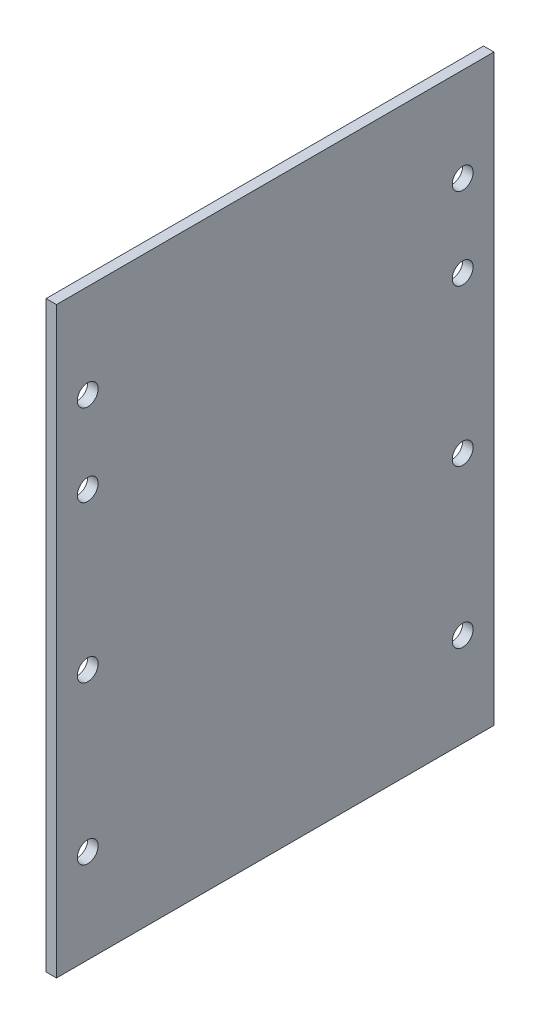
ISO-10303-21;
HEADER;
FILE_DESCRIPTION(('STEP AP214'),'2;1');
FILE_NAME('part.step','',(''),(''),'','','');
FILE_SCHEMA(('AUTOMOTIVE_DESIGN { 1 0 10303 214 1 1 1 1 }'));
ENDSEC;
DATA;
#1=APPLICATION_CONTEXT('core data for automotive mechanical design processes');
#2=APPLICATION_PROTOCOL_DEFINITION('international standard','automotive_design',2000,#1);
#3=PRODUCT_CONTEXT('',#1,'mechanical');
#4=PRODUCT('Part','Part','',(#3));
#5=PRODUCT_RELATED_PRODUCT_CATEGORY('part','',(#4));
#6=PRODUCT_DEFINITION_FORMATION('','',#4);
#7=PRODUCT_DEFINITION_CONTEXT('part definition',#1,'design');
#8=PRODUCT_DEFINITION('design','',#6,#7);
#9=PRODUCT_DEFINITION_SHAPE('','',#8);
#10=(LENGTH_UNIT() NAMED_UNIT(*) SI_UNIT(.MILLI.,.METRE.));
#11=(NAMED_UNIT(*) PLANE_ANGLE_UNIT() SI_UNIT($,.RADIAN.));
#12=(NAMED_UNIT(*) SI_UNIT($,.STERADIAN.) SOLID_ANGLE_UNIT());
#13=UNCERTAINTY_MEASURE_WITH_UNIT(LENGTH_MEASURE(1.E-05),#10,'distance_accuracy_value','');
#14=(GEOMETRIC_REPRESENTATION_CONTEXT(3) GLOBAL_UNCERTAINTY_ASSIGNED_CONTEXT((#13)) GLOBAL_UNIT_ASSIGNED_CONTEXT((#10,
#11,#12)) REPRESENTATION_CONTEXT('',''));
#15=CARTESIAN_POINT('',(0.,0.,0.));
#16=DIRECTION('',(0.,0.,1.));
#17=DIRECTION('',(1.,0.,0.));
#18=AXIS2_PLACEMENT_3D('',#15,#16,#17);
#19=CARTESIAN_POINT('',(-3.175,-88.9,66.675));
#20=DIRECTION('',(0.,0.,-1.));
#21=DIRECTION('',(-1.,0.,0.));
#22=AXIS2_PLACEMENT_3D('',#19,#20,#21);
#23=PLANE('',#22);
#24=DIRECTION('',(0.,1.,0.));
#25=VECTOR('',#24,1.);
#26=CARTESIAN_POINT('',(0.,-88.9,66.675));
#27=LINE('',#26,#25);
#28=CARTESIAN_POINT('',(0.,-88.9,66.675));
#29=VERTEX_POINT('',#28);
#30=CARTESIAN_POINT('',(0.,88.9,66.675));
#31=VERTEX_POINT('',#30);
#32=EDGE_CURVE('E113',#29,#31,#27,.T.);
#33=ORIENTED_EDGE('',*,*,#32,.T.);
#34=DIRECTION('',(1.,0.,0.));
#35=VECTOR('',#34,1.);
#36=CARTESIAN_POINT('',(-3.175,88.9,66.675));
#37=LINE('',#36,#35);
#38=CARTESIAN_POINT('',(-3.175,88.9,66.675));
#39=VERTEX_POINT('',#38);
#40=EDGE_CURVE('E11',#39,#31,#37,.T.);
#41=ORIENTED_EDGE('',*,*,#40,.F.);
#42=DIRECTION('',(0.,1.,0.));
#43=VECTOR('',#42,1.);
#44=CARTESIAN_POINT('',(-3.175,-88.9,66.675));
#45=LINE('',#44,#43);
#46=CARTESIAN_POINT('',(-3.175,-88.9,66.675));
#47=VERTEX_POINT('',#46);
#48=EDGE_CURVE('E95',#47,#39,#45,.T.);
#49=ORIENTED_EDGE('',*,*,#48,.F.);
#50=DIRECTION('',(1.,0.,0.));
#51=VECTOR('',#50,1.);
#52=CARTESIAN_POINT('',(-3.175,-88.9,66.675));
#53=LINE('',#52,#51);
#54=EDGE_CURVE('E62',#47,#29,#53,.T.);
#55=ORIENTED_EDGE('',*,*,#54,.T.);
#56=EDGE_LOOP('',(#33,#41,#49,#55));
#57=FACE_BOUND('',#56,.T.);
#58=ADVANCED_FACE('F45',(#57),#23,.F.);
#59=CARTESIAN_POINT('',(-3.175,88.9,66.675));
#60=DIRECTION('',(0.,-1.,0.));
#61=DIRECTION('',(0.,0.,-1.));
#62=AXIS2_PLACEMENT_3D('',#59,#60,#61);
#63=PLANE('',#62);
#64=DIRECTION('',(0.,0.,-1.));
#65=VECTOR('',#64,1.);
#66=CARTESIAN_POINT('',(0.,88.9,66.675));
#67=LINE('',#66,#65);
#68=CARTESIAN_POINT('',(0.,88.9,-66.675));
#69=VERTEX_POINT('',#68);
#70=EDGE_CURVE('E101',#31,#69,#67,.T.);
#71=ORIENTED_EDGE('',*,*,#70,.T.);
#72=DIRECTION('',(1.,0.,0.));
#73=VECTOR('',#72,1.);
#74=CARTESIAN_POINT('',(-3.175,88.9,-66.675));
#75=LINE('',#74,#73);
#76=CARTESIAN_POINT('',(-3.175,88.9,-66.675));
#77=VERTEX_POINT('',#76);
#78=EDGE_CURVE('E54',#77,#69,#75,.T.);
#79=ORIENTED_EDGE('',*,*,#78,.F.);
#80=DIRECTION('',(0.,0.,-1.));
#81=VECTOR('',#80,1.);
#82=CARTESIAN_POINT('',(-3.175,88.9,66.675));
#83=LINE('',#82,#81);
#84=EDGE_CURVE('E87',#39,#77,#83,.T.);
#85=ORIENTED_EDGE('',*,*,#84,.F.);
#86=ORIENTED_EDGE('',*,*,#40,.T.);
#87=EDGE_LOOP('',(#71,#79,#85,#86));
#88=FACE_BOUND('',#87,.T.);
#89=ADVANCED_FACE('F100',(#88),#63,.F.);
#90=CARTESIAN_POINT('',(-3.175,-88.9,-66.675));
#91=DIRECTION('',(0.,0.,-1.));
#92=DIRECTION('',(-1.,0.,0.));
#93=AXIS2_PLACEMENT_3D('',#90,#91,#92);
#94=PLANE('',#93);
#95=DIRECTION('',(0.,1.,0.));
#96=VECTOR('',#95,1.);
#97=CARTESIAN_POINT('',(0.,-88.9,-66.675));
#98=LINE('',#97,#96);
#99=CARTESIAN_POINT('',(0.,-88.9,-66.675));
#100=VERTEX_POINT('',#99);
#101=EDGE_CURVE('E119',#100,#69,#98,.T.);
#102=ORIENTED_EDGE('',*,*,#101,.F.);
#103=DIRECTION('',(1.,0.,0.));
#104=VECTOR('',#103,1.);
#105=CARTESIAN_POINT('',(-3.175,-88.9,-66.675));
#106=LINE('',#105,#104);
#107=CARTESIAN_POINT('',(-3.175,-88.9,-66.675));
#108=VERTEX_POINT('',#107);
#109=EDGE_CURVE('E76',#108,#100,#106,.T.);
#110=ORIENTED_EDGE('',*,*,#109,.F.);
#111=DIRECTION('',(0.,1.,0.));
#112=VECTOR('',#111,1.);
#113=CARTESIAN_POINT('',(-3.175,-88.9,-66.675));
#114=LINE('',#113,#112);
#115=EDGE_CURVE('E94',#108,#77,#114,.T.);
#116=ORIENTED_EDGE('',*,*,#115,.T.);
#117=ORIENTED_EDGE('',*,*,#78,.T.);
#118=EDGE_LOOP('',(#102,#110,#116,#117));
#119=FACE_BOUND('',#118,.T.);
#120=ADVANCED_FACE('F105',(#119),#94,.T.);
#121=CARTESIAN_POINT('',(-3.175,-88.9,66.675));
#122=DIRECTION('',(0.,-1.,0.));
#123=DIRECTION('',(0.,0.,-1.));
#124=AXIS2_PLACEMENT_3D('',#121,#122,#123);
#125=PLANE('',#124);
#126=DIRECTION('',(0.,0.,-1.));
#127=VECTOR('',#126,1.);
#128=CARTESIAN_POINT('',(0.,-88.9,66.675));
#129=LINE('',#128,#127);
#130=EDGE_CURVE('E122',#29,#100,#129,.T.);
#131=ORIENTED_EDGE('',*,*,#130,.F.);
#132=ORIENTED_EDGE('',*,*,#54,.F.);
#133=DIRECTION('',(0.,0.,-1.));
#134=VECTOR('',#133,1.);
#135=CARTESIAN_POINT('',(-3.175,-88.9,66.675));
#136=LINE('',#135,#134);
#137=EDGE_CURVE('E107',#47,#108,#136,.T.);
#138=ORIENTED_EDGE('',*,*,#137,.T.);
#139=ORIENTED_EDGE('',*,*,#109,.T.);
#140=EDGE_LOOP('',(#131,#132,#138,#139));
#141=FACE_BOUND('',#140,.T.);
#142=ADVANCED_FACE('F209',(#141),#125,.T.);
#143=CARTESIAN_POINT('',(-3.175,0.,0.));
#144=DIRECTION('',(-1.,0.,0.));
#145=DIRECTION('',(0.,0.,1.));
#146=AXIS2_PLACEMENT_3D('',#143,#144,#145);
#147=PLANE('',#146);
#148=CARTESIAN_POINT('',(-3.175,35.349999912,57.15));
#149=DIRECTION('',(1.,0.,0.));
#150=DIRECTION('',(0.,0.,-1.));
#151=AXIS2_PLACEMENT_3D('',#148,#149,#150);
#152=CIRCLE('',#151,3.17500000000001);
#153=CARTESIAN_POINT('',(-3.175,35.349999912,53.975));
#154=VERTEX_POINT('',#153);
#155=EDGE_CURVE('E156',#154,#154,#152,.T.);
#156=ORIENTED_EDGE('',*,*,#155,.T.);
#157=EDGE_LOOP('',(#156));
#158=FACE_BOUND('',#157,.T.);
#159=CARTESIAN_POINT('',(-3.175,-60.325,-57.15));
#160=DIRECTION('',(1.,0.,0.));
#161=DIRECTION('',(0.,0.,1.));
#162=AXIS2_PLACEMENT_3D('',#159,#160,#161);
#163=CIRCLE('',#162,3.175);
#164=CARTESIAN_POINT('',(-3.175,-60.325,-53.975));
#165=VERTEX_POINT('',#164);
#166=EDGE_CURVE('E165',#165,#165,#163,.T.);
#167=ORIENTED_EDGE('',*,*,#166,.T.);
#168=EDGE_LOOP('',(#167));
#169=FACE_BOUND('',#168,.T.);
#170=CARTESIAN_POINT('',(-3.175,-12.275000088,-57.15));
#171=DIRECTION('',(1.,0.,0.));
#172=DIRECTION('',(0.,0.,1.));
#173=AXIS2_PLACEMENT_3D('',#170,#171,#172);
#174=CIRCLE('',#173,3.175);
#175=CARTESIAN_POINT('',(-3.175,-12.275000088,-53.975));
#176=VERTEX_POINT('',#175);
#177=EDGE_CURVE('E140',#176,#176,#174,.T.);
#178=ORIENTED_EDGE('',*,*,#177,.T.);
#179=EDGE_LOOP('',(#178));
#180=FACE_BOUND('',#179,.T.);
#181=CARTESIAN_POINT('',(-3.175,60.325,57.15));
#182=DIRECTION('',(1.,0.,0.));
#183=DIRECTION('',(0.,0.,-1.));
#184=AXIS2_PLACEMENT_3D('',#181,#182,#183);
#185=CIRCLE('',#184,3.175);
#186=CARTESIAN_POINT('',(-3.175,60.325,53.975));
#187=VERTEX_POINT('',#186);
#188=EDGE_CURVE('E149',#187,#187,#185,.T.);
#189=ORIENTED_EDGE('',*,*,#188,.T.);
#190=EDGE_LOOP('',(#189));
#191=FACE_BOUND('',#190,.T.);
#192=CARTESIAN_POINT('',(-3.175,35.349999912,-57.15));
#193=DIRECTION('',(1.,0.,0.));
#194=DIRECTION('',(0.,0.,1.));
#195=AXIS2_PLACEMENT_3D('',#192,#193,#194);
#196=CIRCLE('',#195,3.17500000000001);
#197=CARTESIAN_POINT('',(-3.175,35.349999912,-53.975));
#198=VERTEX_POINT('',#197);
#199=EDGE_CURVE('E188',#198,#198,#196,.T.);
#200=ORIENTED_EDGE('',*,*,#199,.T.);
#201=EDGE_LOOP('',(#200));
#202=FACE_BOUND('',#201,.T.);
#203=CARTESIAN_POINT('',(-3.175,60.325,-57.15));
#204=DIRECTION('',(1.,0.,0.));
#205=DIRECTION('',(0.,0.,1.));
#206=AXIS2_PLACEMENT_3D('',#203,#204,#205);
#207=CIRCLE('',#206,3.175);
#208=CARTESIAN_POINT('',(-3.175,60.325,-53.975));
#209=VERTEX_POINT('',#208);
#210=EDGE_CURVE('E180',#209,#209,#207,.T.);
#211=ORIENTED_EDGE('',*,*,#210,.T.);
#212=EDGE_LOOP('',(#211));
#213=FACE_BOUND('',#212,.T.);
#214=CARTESIAN_POINT('',(-3.175,-12.275000088,57.15));
#215=DIRECTION('',(1.,0.,0.));
#216=DIRECTION('',(0.,0.,-1.));
#217=AXIS2_PLACEMENT_3D('',#214,#215,#216);
#218=CIRCLE('',#217,3.175);
#219=CARTESIAN_POINT('',(-3.175,-12.275000088,53.975));
#220=VERTEX_POINT('',#219);
#221=EDGE_CURVE('E172',#220,#220,#218,.T.);
#222=ORIENTED_EDGE('',*,*,#221,.T.);
#223=EDGE_LOOP('',(#222));
#224=FACE_BOUND('',#223,.T.);
#225=CARTESIAN_POINT('',(-3.175,-60.325,57.15));
#226=DIRECTION('',(1.,0.,0.));
#227=DIRECTION('',(0.,0.,-1.));
#228=AXIS2_PLACEMENT_3D('',#225,#226,#227);
#229=CIRCLE('',#228,3.175);
#230=CARTESIAN_POINT('',(-3.175,-60.325,53.975));
#231=VERTEX_POINT('',#230);
#232=EDGE_CURVE('E116',#231,#231,#229,.T.);
#233=ORIENTED_EDGE('',*,*,#232,.T.);
#234=EDGE_LOOP('',(#233));
#235=FACE_BOUND('',#234,.T.);
#236=ORIENTED_EDGE('',*,*,#48,.T.);
#237=ORIENTED_EDGE('',*,*,#84,.T.);
#238=ORIENTED_EDGE('',*,*,#115,.F.);
#239=ORIENTED_EDGE('',*,*,#137,.F.);
#240=EDGE_LOOP('',(#236,#237,#238,#239));
#241=FACE_BOUND('',#240,.T.);
#242=ADVANCED_FACE('F91',(#158,#169,#180,#191,#202,#213,#224,#235,#241),#147,.T.);
#243=CARTESIAN_POINT('',(0.,0.,0.));
#244=DIRECTION('',(-1.,0.,0.));
#245=DIRECTION('',(0.,0.,1.));
#246=AXIS2_PLACEMENT_3D('',#243,#244,#245);
#247=PLANE('',#246);
#248=CARTESIAN_POINT('',(0.,35.349999912,57.15));
#249=DIRECTION('',(1.,0.,0.));
#250=DIRECTION('',(0.,0.,-1.));
#251=AXIS2_PLACEMENT_3D('',#248,#249,#250);
#252=CIRCLE('',#251,3.17500000000001);
#253=CARTESIAN_POINT('',(0.,35.349999912,53.975));
#254=VERTEX_POINT('',#253);
#255=EDGE_CURVE('E160',#254,#254,#252,.T.);
#256=ORIENTED_EDGE('',*,*,#255,.F.);
#257=EDGE_LOOP('',(#256));
#258=FACE_BOUND('',#257,.T.);
#259=CARTESIAN_POINT('',(0.,-60.325,-57.15));
#260=DIRECTION('',(1.,0.,0.));
#261=DIRECTION('',(0.,0.,1.));
#262=AXIS2_PLACEMENT_3D('',#259,#260,#261);
#263=CIRCLE('',#262,3.175);
#264=CARTESIAN_POINT('',(0.,-60.325,-53.975));
#265=VERTEX_POINT('',#264);
#266=EDGE_CURVE('E145',#265,#265,#263,.T.);
#267=ORIENTED_EDGE('',*,*,#266,.F.);
#268=EDGE_LOOP('',(#267));
#269=FACE_BOUND('',#268,.T.);
#270=CARTESIAN_POINT('',(0.,-12.275000088,-57.15));
#271=DIRECTION('',(1.,0.,0.));
#272=DIRECTION('',(0.,0.,1.));
#273=AXIS2_PLACEMENT_3D('',#270,#271,#272);
#274=CIRCLE('',#273,3.175);
#275=CARTESIAN_POINT('',(0.,-12.275000088,-53.975));
#276=VERTEX_POINT('',#275);
#277=EDGE_CURVE('E144',#276,#276,#274,.T.);
#278=ORIENTED_EDGE('',*,*,#277,.F.);
#279=EDGE_LOOP('',(#278));
#280=FACE_BOUND('',#279,.T.);
#281=CARTESIAN_POINT('',(0.,60.325,57.15));
#282=DIRECTION('',(1.,0.,0.));
#283=DIRECTION('',(0.,0.,-1.));
#284=AXIS2_PLACEMENT_3D('',#281,#282,#283);
#285=CIRCLE('',#284,3.175);
#286=CARTESIAN_POINT('',(0.,60.325,53.975));
#287=VERTEX_POINT('',#286);
#288=EDGE_CURVE('E136',#287,#287,#285,.T.);
#289=ORIENTED_EDGE('',*,*,#288,.F.);
#290=EDGE_LOOP('',(#289));
#291=FACE_BOUND('',#290,.T.);
#292=CARTESIAN_POINT('',(0.,35.349999912,-57.15));
#293=DIRECTION('',(1.,0.,0.));
#294=DIRECTION('',(0.,0.,1.));
#295=AXIS2_PLACEMENT_3D('',#292,#293,#294);
#296=CIRCLE('',#295,3.17500000000001);
#297=CARTESIAN_POINT('',(0.,35.349999912,-53.975));
#298=VERTEX_POINT('',#297);
#299=EDGE_CURVE('E161',#298,#298,#296,.T.);
#300=ORIENTED_EDGE('',*,*,#299,.F.);
#301=EDGE_LOOP('',(#300));
#302=FACE_BOUND('',#301,.T.);
#303=CARTESIAN_POINT('',(0.,60.325,-57.15));
#304=DIRECTION('',(1.,0.,0.));
#305=DIRECTION('',(0.,0.,1.));
#306=AXIS2_PLACEMENT_3D('',#303,#304,#305);
#307=CIRCLE('',#306,3.175);
#308=CARTESIAN_POINT('',(0.,60.325,-53.975));
#309=VERTEX_POINT('',#308);
#310=EDGE_CURVE('E184',#309,#309,#307,.T.);
#311=ORIENTED_EDGE('',*,*,#310,.F.);
#312=EDGE_LOOP('',(#311));
#313=FACE_BOUND('',#312,.T.);
#314=CARTESIAN_POINT('',(0.,-12.275000088,57.15));
#315=DIRECTION('',(1.,0.,0.));
#316=DIRECTION('',(0.,0.,-1.));
#317=AXIS2_PLACEMENT_3D('',#314,#315,#316);
#318=CIRCLE('',#317,3.175);
#319=CARTESIAN_POINT('',(0.,-12.275000088,53.975));
#320=VERTEX_POINT('',#319);
#321=EDGE_CURVE('E176',#320,#320,#318,.T.);
#322=ORIENTED_EDGE('',*,*,#321,.F.);
#323=EDGE_LOOP('',(#322));
#324=FACE_BOUND('',#323,.T.);
#325=CARTESIAN_POINT('',(0.,-60.325,57.15));
#326=DIRECTION('',(1.,0.,0.));
#327=DIRECTION('',(0.,0.,-1.));
#328=AXIS2_PLACEMENT_3D('',#325,#326,#327);
#329=CIRCLE('',#328,3.175);
#330=CARTESIAN_POINT('',(0.,-60.325,53.975));
#331=VERTEX_POINT('',#330);
#332=EDGE_CURVE('E132',#331,#331,#329,.T.);
#333=ORIENTED_EDGE('',*,*,#332,.F.);
#334=EDGE_LOOP('',(#333));
#335=FACE_BOUND('',#334,.T.);
#336=ORIENTED_EDGE('',*,*,#32,.F.);
#337=ORIENTED_EDGE('',*,*,#130,.T.);
#338=ORIENTED_EDGE('',*,*,#101,.T.);
#339=ORIENTED_EDGE('',*,*,#70,.F.);
#340=EDGE_LOOP('',(#336,#337,#338,#339));
#341=FACE_BOUND('',#340,.T.);
#342=ADVANCED_FACE('F198',(#258,#269,#280,#291,#302,#313,#324,#335,#341),#247,.F.);
#343=CARTESIAN_POINT('',(-3.175,-60.325,57.15));
#344=DIRECTION('',(1.,0.,0.));
#345=DIRECTION('',(0.,0.,-1.));
#346=AXIS2_PLACEMENT_3D('',#343,#344,#345);
#347=CYLINDRICAL_SURFACE('',#346,3.175);
#348=ORIENTED_EDGE('',*,*,#232,.F.);
#349=EDGE_LOOP('',(#348));
#350=FACE_BOUND('',#349,.T.);
#351=ORIENTED_EDGE('',*,*,#332,.T.);
#352=EDGE_LOOP('',(#351));
#353=FACE_BOUND('',#352,.T.);
#354=ADVANCED_FACE('F201',(#350,#353),#347,.F.);
#355=CARTESIAN_POINT('',(-3.175,-12.275000088,57.15));
#356=DIRECTION('',(1.,0.,0.));
#357=DIRECTION('',(0.,0.,-1.));
#358=AXIS2_PLACEMENT_3D('',#355,#356,#357);
#359=CYLINDRICAL_SURFACE('',#358,3.175);
#360=ORIENTED_EDGE('',*,*,#221,.F.);
#361=EDGE_LOOP('',(#360));
#362=FACE_BOUND('',#361,.T.);
#363=ORIENTED_EDGE('',*,*,#321,.T.);
#364=EDGE_LOOP('',(#363));
#365=FACE_BOUND('',#364,.T.);
#366=ADVANCED_FACE('F256',(#362,#365),#359,.F.);
#367=CARTESIAN_POINT('',(-3.175,60.325,-57.15));
#368=DIRECTION('',(1.,0.,0.));
#369=DIRECTION('',(0.,0.,-1.));
#370=AXIS2_PLACEMENT_3D('',#367,#368,#369);
#371=CYLINDRICAL_SURFACE('',#370,3.175);
#372=ORIENTED_EDGE('',*,*,#210,.F.);
#373=EDGE_LOOP('',(#372));
#374=FACE_BOUND('',#373,.T.);
#375=ORIENTED_EDGE('',*,*,#310,.T.);
#376=EDGE_LOOP('',(#375));
#377=FACE_BOUND('',#376,.T.);
#378=ADVANCED_FACE('F266',(#374,#377),#371,.F.);
#379=CARTESIAN_POINT('',(-3.175,35.349999912,-57.15));
#380=DIRECTION('',(1.,0.,0.));
#381=DIRECTION('',(0.,0.,-1.));
#382=AXIS2_PLACEMENT_3D('',#379,#380,#381);
#383=CYLINDRICAL_SURFACE('',#382,3.17500000000001);
#384=ORIENTED_EDGE('',*,*,#199,.F.);
#385=EDGE_LOOP('',(#384));
#386=FACE_BOUND('',#385,.T.);
#387=ORIENTED_EDGE('',*,*,#299,.T.);
#388=EDGE_LOOP('',(#387));
#389=FACE_BOUND('',#388,.T.);
#390=ADVANCED_FACE('F196',(#386,#389),#383,.F.);
#391=CARTESIAN_POINT('',(-3.175,60.325,57.15));
#392=DIRECTION('',(1.,0.,0.));
#393=DIRECTION('',(0.,0.,-1.));
#394=AXIS2_PLACEMENT_3D('',#391,#392,#393);
#395=CYLINDRICAL_SURFACE('',#394,3.175);
#396=ORIENTED_EDGE('',*,*,#188,.F.);
#397=EDGE_LOOP('',(#396));
#398=FACE_BOUND('',#397,.T.);
#399=ORIENTED_EDGE('',*,*,#288,.T.);
#400=EDGE_LOOP('',(#399));
#401=FACE_BOUND('',#400,.T.);
#402=ADVANCED_FACE('F285',(#398,#401),#395,.F.);
#403=CARTESIAN_POINT('',(-3.175,-12.275000088,-57.15));
#404=DIRECTION('',(1.,0.,0.));
#405=DIRECTION('',(0.,0.,-1.));
#406=AXIS2_PLACEMENT_3D('',#403,#404,#405);
#407=CYLINDRICAL_SURFACE('',#406,3.175);
#408=ORIENTED_EDGE('',*,*,#177,.F.);
#409=EDGE_LOOP('',(#408));
#410=FACE_BOUND('',#409,.T.);
#411=ORIENTED_EDGE('',*,*,#277,.T.);
#412=EDGE_LOOP('',(#411));
#413=FACE_BOUND('',#412,.T.);
#414=ADVANCED_FACE('F295',(#410,#413),#407,.F.);
#415=CARTESIAN_POINT('',(-3.175,-60.325,-57.15));
#416=DIRECTION('',(1.,0.,0.));
#417=DIRECTION('',(0.,0.,-1.));
#418=AXIS2_PLACEMENT_3D('',#415,#416,#417);
#419=CYLINDRICAL_SURFACE('',#418,3.175);
#420=ORIENTED_EDGE('',*,*,#166,.F.);
#421=EDGE_LOOP('',(#420));
#422=FACE_BOUND('',#421,.T.);
#423=ORIENTED_EDGE('',*,*,#266,.T.);
#424=EDGE_LOOP('',(#423));
#425=FACE_BOUND('',#424,.T.);
#426=ADVANCED_FACE('F305',(#422,#425),#419,.F.);
#427=CARTESIAN_POINT('',(-3.175,35.349999912,57.15));
#428=DIRECTION('',(1.,0.,0.));
#429=DIRECTION('',(0.,0.,-1.));
#430=AXIS2_PLACEMENT_3D('',#427,#428,#429);
#431=CYLINDRICAL_SURFACE('',#430,3.17500000000001);
#432=ORIENTED_EDGE('',*,*,#155,.F.);
#433=EDGE_LOOP('',(#432));
#434=FACE_BOUND('',#433,.T.);
#435=ORIENTED_EDGE('',*,*,#255,.T.);
#436=EDGE_LOOP('',(#435));
#437=FACE_BOUND('',#436,.T.);
#438=ADVANCED_FACE('F315',(#434,#437),#431,.F.);
#439=CLOSED_SHELL('',(#58,#89,#120,#142,#242,#342,#354,#366,#378,#390,#402,#414,#426,#438));
#440=MANIFOLD_SOLID_BREP('B2',#439);
#441=ADVANCED_BREP_SHAPE_REPRESENTATION('',(#18,#440),#14);
#442=SHAPE_DEFINITION_REPRESENTATION(#9,#441);
ENDSEC;
END-ISO-10303-21;
